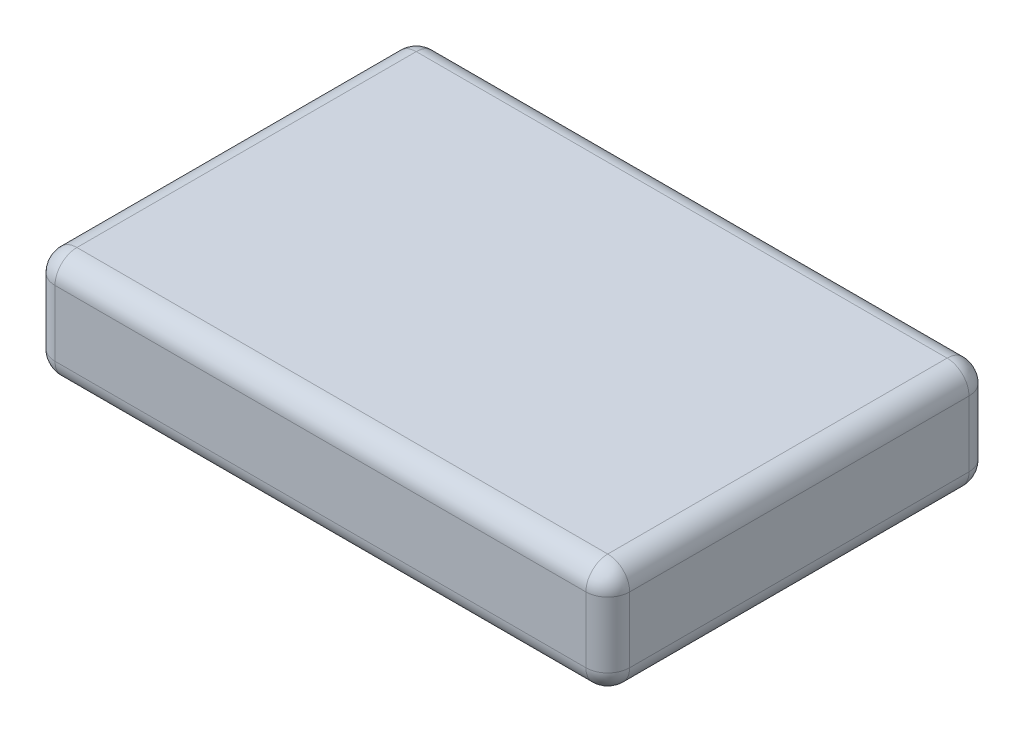
ISO-10303-21;
HEADER;
FILE_DESCRIPTION(('STEP AP214'),'2;1');
FILE_NAME('part.step','',(''),(''),'','','');
FILE_SCHEMA(('AUTOMOTIVE_DESIGN { 1 0 10303 214 1 1 1 1 }'));
ENDSEC;
DATA;
#1=APPLICATION_CONTEXT('core data for automotive mechanical design processes');
#2=APPLICATION_PROTOCOL_DEFINITION('international standard','automotive_design',2000,#1);
#3=PRODUCT_CONTEXT('',#1,'mechanical');
#4=PRODUCT('Part','Part','',(#3));
#5=PRODUCT_RELATED_PRODUCT_CATEGORY('part','',(#4));
#6=PRODUCT_DEFINITION_FORMATION('','',#4);
#7=PRODUCT_DEFINITION_CONTEXT('part definition',#1,'design');
#8=PRODUCT_DEFINITION('design','',#6,#7);
#9=PRODUCT_DEFINITION_SHAPE('','',#8);
#10=(LENGTH_UNIT() NAMED_UNIT(*) SI_UNIT(.MILLI.,.METRE.));
#11=(NAMED_UNIT(*) PLANE_ANGLE_UNIT() SI_UNIT($,.RADIAN.));
#12=(NAMED_UNIT(*) SI_UNIT($,.STERADIAN.) SOLID_ANGLE_UNIT());
#13=UNCERTAINTY_MEASURE_WITH_UNIT(LENGTH_MEASURE(1.E-05),#10,'distance_accuracy_value','');
#14=(GEOMETRIC_REPRESENTATION_CONTEXT(3) GLOBAL_UNCERTAINTY_ASSIGNED_CONTEXT((#13)) GLOBAL_UNIT_ASSIGNED_CONTEXT((#10,
#11,#12)) REPRESENTATION_CONTEXT('',''));
#15=CARTESIAN_POINT('',(0.,0.,0.));
#16=DIRECTION('',(0.,0.,1.));
#17=DIRECTION('',(1.,0.,0.));
#18=AXIS2_PLACEMENT_3D('',#15,#16,#17);
#19=CARTESIAN_POINT('',(48.5,28.,46.));
#20=DIRECTION('',(0.,-1.,0.));
#21=DIRECTION('',(1.,0.,0.));
#22=AXIS2_PLACEMENT_3D('',#19,#20,#21);
#23=SPHERICAL_SURFACE('',#22,4.);
#24=CARTESIAN_POINT('',(48.5,28.,46.));
#25=DIRECTION('',(0.,0.,-1.));
#26=DIRECTION('',(1.,0.,0.));
#27=AXIS2_PLACEMENT_3D('',#24,#25,#26);
#28=CIRCLE('',#27,4.);
#29=CARTESIAN_POINT('',(48.5,32.,46.));
#30=VERTEX_POINT('',#29);
#31=CARTESIAN_POINT('',(52.5,28.,46.));
#32=VERTEX_POINT('',#31);
#33=EDGE_CURVE('E10',#30,#32,#28,.T.);
#34=ORIENTED_EDGE('',*,*,#33,.F.);
#35=CARTESIAN_POINT('',(48.5,28.,46.));
#36=DIRECTION('',(1.,0.,0.));
#37=DIRECTION('',(0.,0.,1.));
#38=AXIS2_PLACEMENT_3D('',#35,#36,#37);
#39=CIRCLE('',#38,4.);
#40=CARTESIAN_POINT('',(48.5,28.,50.));
#41=VERTEX_POINT('',#40);
#42=EDGE_CURVE('E228',#30,#41,#39,.T.);
#43=ORIENTED_EDGE('',*,*,#42,.T.);
#44=CARTESIAN_POINT('',(48.5,28.,46.));
#45=DIRECTION('',(0.,-1.,0.));
#46=DIRECTION('',(1.,0.,0.));
#47=AXIS2_PLACEMENT_3D('',#44,#45,#46);
#48=CIRCLE('',#47,4.);
#49=EDGE_CURVE('E189',#32,#41,#48,.T.);
#50=ORIENTED_EDGE('',*,*,#49,.F.);
#51=EDGE_LOOP('',(#34,#43,#50));
#52=FACE_BOUND('',#51,.T.);
#53=ADVANCED_FACE('F16',(#52),#23,.T.);
#54=CARTESIAN_POINT('',(48.5,28.,-16.));
#55=DIRECTION('',(0.,0.,1.));
#56=DIRECTION('',(1.,0.,0.));
#57=AXIS2_PLACEMENT_3D('',#54,#55,#56);
#58=SPHERICAL_SURFACE('',#57,4.);
#59=CARTESIAN_POINT('',(48.5,28.,-16.));
#60=DIRECTION('',(0.,-1.,0.));
#61=DIRECTION('',(1.,0.,0.));
#62=AXIS2_PLACEMENT_3D('',#59,#60,#61);
#63=CIRCLE('',#62,4.);
#64=CARTESIAN_POINT('',(48.5,28.,-20.));
#65=VERTEX_POINT('',#64);
#66=CARTESIAN_POINT('',(52.5,28.,-16.));
#67=VERTEX_POINT('',#66);
#68=EDGE_CURVE('E186',#65,#67,#63,.T.);
#69=ORIENTED_EDGE('',*,*,#68,.F.);
#70=CARTESIAN_POINT('',(48.5,28.,-16.));
#71=DIRECTION('',(1.,0.,0.));
#72=DIRECTION('',(0.,1.,0.));
#73=AXIS2_PLACEMENT_3D('',#70,#71,#72);
#74=CIRCLE('',#73,4.);
#75=CARTESIAN_POINT('',(48.5,32.,-16.));
#76=VERTEX_POINT('',#75);
#77=EDGE_CURVE('E280',#65,#76,#74,.T.);
#78=ORIENTED_EDGE('',*,*,#77,.T.);
#79=CARTESIAN_POINT('',(48.5,28.,-16.));
#80=DIRECTION('',(0.,0.,1.));
#81=DIRECTION('',(1.,0.,0.));
#82=AXIS2_PLACEMENT_3D('',#79,#80,#81);
#83=CIRCLE('',#82,4.);
#84=EDGE_CURVE('E25',#67,#76,#83,.T.);
#85=ORIENTED_EDGE('',*,*,#84,.F.);
#86=EDGE_LOOP('',(#69,#78,#85));
#87=FACE_BOUND('',#86,.T.);
#88=ADVANCED_FACE('F330',(#87),#58,.T.);
#89=CARTESIAN_POINT('',(52.5,12.,-20.));
#90=DIRECTION('',(1.,0.,0.));
#91=DIRECTION('',(0.,1.,0.));
#92=AXIS2_PLACEMENT_3D('',#89,#90,#91);
#93=PLANE('',#92);
#94=DIRECTION('',(0.,0.,1.));
#95=VECTOR('',#94,1.);
#96=CARTESIAN_POINT('',(52.5,16.,-20.));
#97=LINE('',#96,#95);
#98=CARTESIAN_POINT('',(52.5,16.,-16.));
#99=VERTEX_POINT('',#98);
#100=CARTESIAN_POINT('',(52.5,16.,46.));
#101=VERTEX_POINT('',#100);
#102=EDGE_CURVE('E206',#99,#101,#97,.T.);
#103=ORIENTED_EDGE('',*,*,#102,.F.);
#104=DIRECTION('',(0.,1.,0.));
#105=VECTOR('',#104,1.);
#106=CARTESIAN_POINT('',(52.5,12.,-16.));
#107=LINE('',#106,#105);
#108=EDGE_CURVE('E232',#99,#67,#107,.T.);
#109=ORIENTED_EDGE('',*,*,#108,.T.);
#110=DIRECTION('',(0.,0.,1.));
#111=VECTOR('',#110,1.);
#112=CARTESIAN_POINT('',(52.5,28.,-20.));
#113=LINE('',#112,#111);
#114=EDGE_CURVE('E241',#67,#32,#113,.T.);
#115=ORIENTED_EDGE('',*,*,#114,.T.);
#116=DIRECTION('',(0.,1.,0.));
#117=VECTOR('',#116,1.);
#118=CARTESIAN_POINT('',(52.5,12.,46.));
#119=LINE('',#118,#117);
#120=EDGE_CURVE('E192',#101,#32,#119,.T.);
#121=ORIENTED_EDGE('',*,*,#120,.F.);
#122=EDGE_LOOP('',(#103,#109,#115,#121));
#123=FACE_BOUND('',#122,.T.);
#124=ADVANCED_FACE('F361',(#123),#93,.T.);
#125=CARTESIAN_POINT('',(48.5,16.,46.));
#126=DIRECTION('',(0.,0.,-1.));
#127=DIRECTION('',(1.,0.,0.));
#128=AXIS2_PLACEMENT_3D('',#125,#126,#127);
#129=SPHERICAL_SURFACE('',#128,4.);
#130=CARTESIAN_POINT('',(48.5,16.,46.));
#131=DIRECTION('',(0.,1.,0.));
#132=DIRECTION('',(1.,0.,0.));
#133=AXIS2_PLACEMENT_3D('',#130,#131,#132);
#134=CIRCLE('',#133,4.);
#135=CARTESIAN_POINT('',(48.5,16.,50.));
#136=VERTEX_POINT('',#135);
#137=EDGE_CURVE('E19',#136,#101,#134,.T.);
#138=ORIENTED_EDGE('',*,*,#137,.F.);
#139=CARTESIAN_POINT('',(48.5,16.,46.));
#140=DIRECTION('',(1.,0.,0.));
#141=DIRECTION('',(0.,-1.,0.));
#142=AXIS2_PLACEMENT_3D('',#139,#140,#141);
#143=CIRCLE('',#142,4.);
#144=CARTESIAN_POINT('',(48.5,12.,46.));
#145=VERTEX_POINT('',#144);
#146=EDGE_CURVE('E305',#136,#145,#143,.T.);
#147=ORIENTED_EDGE('',*,*,#146,.T.);
#148=CARTESIAN_POINT('',(48.5,16.,46.));
#149=DIRECTION('',(0.,0.,-1.));
#150=DIRECTION('',(1.,0.,0.));
#151=AXIS2_PLACEMENT_3D('',#148,#149,#150);
#152=CIRCLE('',#151,4.);
#153=EDGE_CURVE('E207',#101,#145,#152,.T.);
#154=ORIENTED_EDGE('',*,*,#153,.F.);
#155=EDGE_LOOP('',(#138,#147,#154));
#156=FACE_BOUND('',#155,.T.);
#157=ADVANCED_FACE('F368',(#156),#129,.T.);
#158=CARTESIAN_POINT('',(48.5,16.,-16.));
#159=DIRECTION('',(0.,0.,1.));
#160=DIRECTION('',(1.,0.,0.));
#161=AXIS2_PLACEMENT_3D('',#158,#159,#160);
#162=SPHERICAL_SURFACE('',#161,4.);
#163=CARTESIAN_POINT('',(48.5,16.,-16.));
#164=DIRECTION('',(0.,0.,-1.));
#165=DIRECTION('',(1.,0.,0.));
#166=AXIS2_PLACEMENT_3D('',#163,#164,#165);
#167=CIRCLE('',#166,4.);
#168=CARTESIAN_POINT('',(48.5,12.,-16.));
#169=VERTEX_POINT('',#168);
#170=EDGE_CURVE('E203',#99,#169,#167,.T.);
#171=ORIENTED_EDGE('',*,*,#170,.T.);
#172=CARTESIAN_POINT('',(48.5,16.,-16.));
#173=DIRECTION('',(-1.,0.,0.));
#174=DIRECTION('',(0.,-1.,0.));
#175=AXIS2_PLACEMENT_3D('',#172,#173,#174);
#176=CIRCLE('',#175,4.);
#177=CARTESIAN_POINT('',(48.5,16.,-20.));
#178=VERTEX_POINT('',#177);
#179=EDGE_CURVE('E301',#178,#169,#176,.T.);
#180=ORIENTED_EDGE('',*,*,#179,.F.);
#181=CARTESIAN_POINT('',(48.5,16.,-16.));
#182=DIRECTION('',(0.,-1.,0.));
#183=DIRECTION('',(1.,0.,0.));
#184=AXIS2_PLACEMENT_3D('',#181,#182,#183);
#185=CIRCLE('',#184,4.);
#186=EDGE_CURVE('E283',#178,#99,#185,.T.);
#187=ORIENTED_EDGE('',*,*,#186,.T.);
#188=EDGE_LOOP('',(#171,#180,#187));
#189=FACE_BOUND('',#188,.T.);
#190=ADVANCED_FACE('F411',(#189),#162,.T.);
#191=CARTESIAN_POINT('',(48.5,28.,-20.));
#192=DIRECTION('',(0.,0.,1.));
#193=DIRECTION('',(1.,0.,0.));
#194=AXIS2_PLACEMENT_3D('',#191,#192,#193);
#195=CYLINDRICAL_SURFACE('',#194,4.);
#196=ORIENTED_EDGE('',*,*,#114,.F.);
#197=ORIENTED_EDGE('',*,*,#84,.T.);
#198=DIRECTION('',(0.,0.,1.));
#199=VECTOR('',#198,1.);
#200=CARTESIAN_POINT('',(48.5,32.,-20.));
#201=LINE('',#200,#199);
#202=EDGE_CURVE('E294',#76,#30,#201,.T.);
#203=ORIENTED_EDGE('',*,*,#202,.T.);
#204=ORIENTED_EDGE('',*,*,#33,.T.);
#205=EDGE_LOOP('',(#196,#197,#203,#204));
#206=FACE_BOUND('',#205,.T.);
#207=ADVANCED_FACE('F337',(#206),#195,.T.);
#208=CARTESIAN_POINT('',(48.5,12.,46.));
#209=DIRECTION('',(0.,1.,0.));
#210=DIRECTION('',(1.,0.,0.));
#211=AXIS2_PLACEMENT_3D('',#208,#209,#210);
#212=CYLINDRICAL_SURFACE('',#211,4.);
#213=ORIENTED_EDGE('',*,*,#120,.T.);
#214=ORIENTED_EDGE('',*,*,#49,.T.);
#215=DIRECTION('',(0.,1.,0.));
#216=VECTOR('',#215,1.);
#217=CARTESIAN_POINT('',(48.5,12.,50.));
#218=LINE('',#217,#216);
#219=EDGE_CURVE('E275',#136,#41,#218,.T.);
#220=ORIENTED_EDGE('',*,*,#219,.F.);
#221=ORIENTED_EDGE('',*,*,#137,.T.);
#222=EDGE_LOOP('',(#213,#214,#220,#221));
#223=FACE_BOUND('',#222,.T.);
#224=ADVANCED_FACE('F360',(#223),#212,.T.);
#225=CARTESIAN_POINT('',(-52.5,28.,46.));
#226=DIRECTION('',(1.,0.,0.));
#227=DIRECTION('',(0.,1.,0.));
#228=AXIS2_PLACEMENT_3D('',#225,#226,#227);
#229=CYLINDRICAL_SURFACE('',#228,4.);
#230=CARTESIAN_POINT('',(-48.5,28.,46.));
#231=DIRECTION('',(1.,0.,0.));
#232=DIRECTION('',(0.,0.,1.));
#233=AXIS2_PLACEMENT_3D('',#230,#231,#232);
#234=CIRCLE('',#233,4.);
#235=CARTESIAN_POINT('',(-48.5,32.,46.));
#236=VERTEX_POINT('',#235);
#237=CARTESIAN_POINT('',(-48.5,28.,50.));
#238=VERTEX_POINT('',#237);
#239=EDGE_CURVE('E287',#236,#238,#234,.T.);
#240=ORIENTED_EDGE('',*,*,#239,.T.);
#241=DIRECTION('',(1.,0.,0.));
#242=VECTOR('',#241,1.);
#243=CARTESIAN_POINT('',(-52.5,28.,50.));
#244=LINE('',#243,#242);
#245=EDGE_CURVE('E279',#238,#41,#244,.T.);
#246=ORIENTED_EDGE('',*,*,#245,.T.);
#247=ORIENTED_EDGE('',*,*,#42,.F.);
#248=DIRECTION('',(1.,0.,0.));
#249=VECTOR('',#248,1.);
#250=CARTESIAN_POINT('',(-52.5,32.,46.));
#251=LINE('',#250,#249);
#252=EDGE_CURVE('E290',#236,#30,#251,.T.);
#253=ORIENTED_EDGE('',*,*,#252,.F.);
#254=EDGE_LOOP('',(#240,#246,#247,#253));
#255=FACE_BOUND('',#254,.T.);
#256=ADVANCED_FACE('F355',(#255),#229,.T.);
#257=CARTESIAN_POINT('',(48.5,12.,-16.));
#258=DIRECTION('',(0.,1.,0.));
#259=DIRECTION('',(1.,0.,0.));
#260=AXIS2_PLACEMENT_3D('',#257,#258,#259);
#261=CYLINDRICAL_SURFACE('',#260,4.);
#262=ORIENTED_EDGE('',*,*,#186,.F.);
#263=DIRECTION('',(0.,1.,0.));
#264=VECTOR('',#263,1.);
#265=CARTESIAN_POINT('',(48.5,12.,-20.));
#266=LINE('',#265,#264);
#267=EDGE_CURVE('E259',#178,#65,#266,.T.);
#268=ORIENTED_EDGE('',*,*,#267,.T.);
#269=ORIENTED_EDGE('',*,*,#68,.T.);
#270=ORIENTED_EDGE('',*,*,#108,.F.);
#271=EDGE_LOOP('',(#262,#268,#269,#270));
#272=FACE_BOUND('',#271,.T.);
#273=ADVANCED_FACE('F327',(#272),#261,.T.);
#274=CARTESIAN_POINT('',(-52.5,28.,-16.));
#275=DIRECTION('',(1.,0.,0.));
#276=DIRECTION('',(0.,1.,0.));
#277=AXIS2_PLACEMENT_3D('',#274,#275,#276);
#278=CYLINDRICAL_SURFACE('',#277,4.);
#279=DIRECTION('',(1.,0.,0.));
#280=VECTOR('',#279,1.);
#281=CARTESIAN_POINT('',(-52.5,32.,-16.));
#282=LINE('',#281,#280);
#283=CARTESIAN_POINT('',(-48.5,32.,-16.));
#284=VERTEX_POINT('',#283);
#285=EDGE_CURVE('E297',#284,#76,#282,.T.);
#286=ORIENTED_EDGE('',*,*,#285,.T.);
#287=ORIENTED_EDGE('',*,*,#77,.F.);
#288=DIRECTION('',(1.,0.,0.));
#289=VECTOR('',#288,1.);
#290=CARTESIAN_POINT('',(-52.5,28.,-20.));
#291=LINE('',#290,#289);
#292=CARTESIAN_POINT('',(-48.5,28.,-20.));
#293=VERTEX_POINT('',#292);
#294=EDGE_CURVE('E220',#293,#65,#291,.T.);
#295=ORIENTED_EDGE('',*,*,#294,.F.);
#296=CARTESIAN_POINT('',(-48.5,28.,-16.));
#297=DIRECTION('',(1.,0.,0.));
#298=DIRECTION('',(0.,1.,0.));
#299=AXIS2_PLACEMENT_3D('',#296,#297,#298);
#300=CIRCLE('',#299,4.);
#301=EDGE_CURVE('E267',#293,#284,#300,.T.);
#302=ORIENTED_EDGE('',*,*,#301,.T.);
#303=EDGE_LOOP('',(#286,#287,#295,#302));
#304=FACE_BOUND('',#303,.T.);
#305=ADVANCED_FACE('F333',(#304),#278,.T.);
#306=CARTESIAN_POINT('',(48.5,16.,-20.));
#307=DIRECTION('',(0.,0.,1.));
#308=DIRECTION('',(1.,0.,0.));
#309=AXIS2_PLACEMENT_3D('',#306,#307,#308);
#310=CYLINDRICAL_SURFACE('',#309,4.);
#311=ORIENTED_EDGE('',*,*,#153,.T.);
#312=DIRECTION('',(0.,0.,1.));
#313=VECTOR('',#312,1.);
#314=CARTESIAN_POINT('',(48.5,12.,-20.));
#315=LINE('',#314,#313);
#316=EDGE_CURVE('E221',#169,#145,#315,.T.);
#317=ORIENTED_EDGE('',*,*,#316,.F.);
#318=ORIENTED_EDGE('',*,*,#170,.F.);
#319=ORIENTED_EDGE('',*,*,#102,.T.);
#320=EDGE_LOOP('',(#311,#317,#318,#319));
#321=FACE_BOUND('',#320,.T.);
#322=ADVANCED_FACE('F365',(#321),#310,.T.);
#323=CARTESIAN_POINT('',(-52.5,16.,46.));
#324=DIRECTION('',(1.,0.,0.));
#325=DIRECTION('',(0.,-1.,0.));
#326=AXIS2_PLACEMENT_3D('',#323,#324,#325);
#327=CYLINDRICAL_SURFACE('',#326,4.);
#328=DIRECTION('',(1.,0.,0.));
#329=VECTOR('',#328,1.);
#330=CARTESIAN_POINT('',(-52.5,12.,46.));
#331=LINE('',#330,#329);
#332=CARTESIAN_POINT('',(-48.5,12.,46.));
#333=VERTEX_POINT('',#332);
#334=EDGE_CURVE('E217',#333,#145,#331,.T.);
#335=ORIENTED_EDGE('',*,*,#334,.T.);
#336=ORIENTED_EDGE('',*,*,#146,.F.);
#337=DIRECTION('',(1.,0.,0.));
#338=VECTOR('',#337,1.);
#339=CARTESIAN_POINT('',(-52.5,16.,50.));
#340=LINE('',#339,#338);
#341=CARTESIAN_POINT('',(-48.5,16.,50.));
#342=VERTEX_POINT('',#341);
#343=EDGE_CURVE('E271',#342,#136,#340,.T.);
#344=ORIENTED_EDGE('',*,*,#343,.F.);
#345=CARTESIAN_POINT('',(-48.5,16.,46.));
#346=DIRECTION('',(1.,0.,0.));
#347=DIRECTION('',(0.,-1.,0.));
#348=AXIS2_PLACEMENT_3D('',#345,#346,#347);
#349=CIRCLE('',#348,4.);
#350=EDGE_CURVE('E141',#342,#333,#349,.T.);
#351=ORIENTED_EDGE('',*,*,#350,.T.);
#352=EDGE_LOOP('',(#335,#336,#344,#351));
#353=FACE_BOUND('',#352,.T.);
#354=ADVANCED_FACE('F371',(#353),#327,.T.);
#355=CARTESIAN_POINT('',(-52.5,16.,-16.));
#356=DIRECTION('',(1.,0.,0.));
#357=DIRECTION('',(0.,-1.,0.));
#358=AXIS2_PLACEMENT_3D('',#355,#356,#357);
#359=CYLINDRICAL_SURFACE('',#358,4.);
#360=CARTESIAN_POINT('',(-48.5,16.,-16.));
#361=DIRECTION('',(-1.,0.,0.));
#362=DIRECTION('',(0.,-1.,0.));
#363=AXIS2_PLACEMENT_3D('',#360,#361,#362);
#364=CIRCLE('',#363,4.);
#365=CARTESIAN_POINT('',(-48.5,16.,-20.));
#366=VERTEX_POINT('',#365);
#367=CARTESIAN_POINT('',(-48.5,12.,-16.));
#368=VERTEX_POINT('',#367);
#369=EDGE_CURVE('E240',#366,#368,#364,.T.);
#370=ORIENTED_EDGE('',*,*,#369,.F.);
#371=DIRECTION('',(1.,0.,0.));
#372=VECTOR('',#371,1.);
#373=CARTESIAN_POINT('',(-52.5,16.,-20.));
#374=LINE('',#373,#372);
#375=EDGE_CURVE('E263',#366,#178,#374,.T.);
#376=ORIENTED_EDGE('',*,*,#375,.T.);
#377=ORIENTED_EDGE('',*,*,#179,.T.);
#378=DIRECTION('',(1.,0.,0.));
#379=VECTOR('',#378,1.);
#380=CARTESIAN_POINT('',(-52.5,12.,-16.));
#381=LINE('',#380,#379);
#382=EDGE_CURVE('E249',#368,#169,#381,.T.);
#383=ORIENTED_EDGE('',*,*,#382,.F.);
#384=EDGE_LOOP('',(#370,#376,#377,#383));
#385=FACE_BOUND('',#384,.T.);
#386=ADVANCED_FACE('F376',(#385),#359,.T.);
#387=CARTESIAN_POINT('',(-52.5,32.,-20.));
#388=DIRECTION('',(0.,1.,0.));
#389=DIRECTION('',(1.,0.,0.));
#390=AXIS2_PLACEMENT_3D('',#387,#388,#389);
#391=PLANE('',#390);
#392=DIRECTION('',(0.,0.,1.));
#393=VECTOR('',#392,1.);
#394=CARTESIAN_POINT('',(-48.5,32.,-20.));
#395=LINE('',#394,#393);
#396=EDGE_CURVE('E200',#284,#236,#395,.T.);
#397=ORIENTED_EDGE('',*,*,#396,.T.);
#398=ORIENTED_EDGE('',*,*,#252,.T.);
#399=ORIENTED_EDGE('',*,*,#202,.F.);
#400=ORIENTED_EDGE('',*,*,#285,.F.);
#401=EDGE_LOOP('',(#397,#398,#399,#400));
#402=FACE_BOUND('',#401,.T.);
#403=ADVANCED_FACE('F336',(#402),#391,.T.);
#404=CARTESIAN_POINT('',(-48.5,28.,46.));
#405=DIRECTION('',(0.,-1.,0.));
#406=DIRECTION('',(-1.,0.,0.));
#407=AXIS2_PLACEMENT_3D('',#404,#405,#406);
#408=SPHERICAL_SURFACE('',#407,4.);
#409=CARTESIAN_POINT('',(-48.5,28.,46.));
#410=DIRECTION('',(0.,1.,0.));
#411=DIRECTION('',(-1.,0.,0.));
#412=AXIS2_PLACEMENT_3D('',#409,#410,#411);
#413=CIRCLE('',#412,4.);
#414=CARTESIAN_POINT('',(-52.5,28.,46.));
#415=VERTEX_POINT('',#414);
#416=EDGE_CURVE('E175',#415,#238,#413,.T.);
#417=ORIENTED_EDGE('',*,*,#416,.T.);
#418=ORIENTED_EDGE('',*,*,#239,.F.);
#419=CARTESIAN_POINT('',(-48.5,28.,46.));
#420=DIRECTION('',(0.,0.,1.));
#421=DIRECTION('',(-1.,0.,0.));
#422=AXIS2_PLACEMENT_3D('',#419,#420,#421);
#423=CIRCLE('',#422,4.);
#424=EDGE_CURVE('E197',#236,#415,#423,.T.);
#425=ORIENTED_EDGE('',*,*,#424,.T.);
#426=EDGE_LOOP('',(#417,#418,#425));
#427=FACE_BOUND('',#426,.T.);
#428=ADVANCED_FACE('F347',(#427),#408,.T.);
#429=CARTESIAN_POINT('',(-52.5,12.,50.));
#430=DIRECTION('',(0.,0.,1.));
#431=DIRECTION('',(1.,0.,0.));
#432=AXIS2_PLACEMENT_3D('',#429,#430,#431);
#433=PLANE('',#432);
#434=DIRECTION('',(0.,1.,0.));
#435=VECTOR('',#434,1.);
#436=CARTESIAN_POINT('',(-48.5,12.,50.));
#437=LINE('',#436,#435);
#438=EDGE_CURVE('E147',#342,#238,#437,.T.);
#439=ORIENTED_EDGE('',*,*,#438,.F.);
#440=ORIENTED_EDGE('',*,*,#343,.T.);
#441=ORIENTED_EDGE('',*,*,#219,.T.);
#442=ORIENTED_EDGE('',*,*,#245,.F.);
#443=EDGE_LOOP('',(#439,#440,#441,#442));
#444=FACE_BOUND('',#443,.T.);
#445=ADVANCED_FACE('F351',(#444),#433,.T.);
#446=CARTESIAN_POINT('',(-48.5,28.,-16.));
#447=DIRECTION('',(0.,0.,1.));
#448=DIRECTION('',(-1.,0.,0.));
#449=AXIS2_PLACEMENT_3D('',#446,#447,#448);
#450=SPHERICAL_SURFACE('',#449,4.);
#451=CARTESIAN_POINT('',(-48.5,28.,-16.));
#452=DIRECTION('',(0.,0.,-1.));
#453=DIRECTION('',(-1.,0.,0.));
#454=AXIS2_PLACEMENT_3D('',#451,#452,#453);
#455=CIRCLE('',#454,4.);
#456=CARTESIAN_POINT('',(-52.5,28.,-16.));
#457=VERTEX_POINT('',#456);
#458=EDGE_CURVE('E236',#457,#284,#455,.T.);
#459=ORIENTED_EDGE('',*,*,#458,.T.);
#460=ORIENTED_EDGE('',*,*,#301,.F.);
#461=CARTESIAN_POINT('',(-48.5,28.,-16.));
#462=DIRECTION('',(0.,1.,0.));
#463=DIRECTION('',(-1.,0.,0.));
#464=AXIS2_PLACEMENT_3D('',#461,#462,#463);
#465=CIRCLE('',#464,4.);
#466=EDGE_CURVE('E160',#293,#457,#465,.T.);
#467=ORIENTED_EDGE('',*,*,#466,.T.);
#468=EDGE_LOOP('',(#459,#460,#467));
#469=FACE_BOUND('',#468,.T.);
#470=ADVANCED_FACE('F389',(#469),#450,.T.);
#471=CARTESIAN_POINT('',(-52.5,12.,-20.));
#472=DIRECTION('',(0.,0.,1.));
#473=DIRECTION('',(1.,0.,0.));
#474=AXIS2_PLACEMENT_3D('',#471,#472,#473);
#475=PLANE('',#474);
#476=ORIENTED_EDGE('',*,*,#294,.T.);
#477=ORIENTED_EDGE('',*,*,#267,.F.);
#478=ORIENTED_EDGE('',*,*,#375,.F.);
#479=DIRECTION('',(0.,1.,0.));
#480=VECTOR('',#479,1.);
#481=CARTESIAN_POINT('',(-48.5,12.,-20.));
#482=LINE('',#481,#480);
#483=EDGE_CURVE('E208',#366,#293,#482,.T.);
#484=ORIENTED_EDGE('',*,*,#483,.T.);
#485=EDGE_LOOP('',(#476,#477,#478,#484));
#486=FACE_BOUND('',#485,.T.);
#487=ADVANCED_FACE('F387',(#486),#475,.F.);
#488=CARTESIAN_POINT('',(-52.5,12.,-20.));
#489=DIRECTION('',(0.,1.,0.));
#490=DIRECTION('',(1.,0.,0.));
#491=AXIS2_PLACEMENT_3D('',#488,#489,#490);
#492=PLANE('',#491);
#493=ORIENTED_EDGE('',*,*,#382,.T.);
#494=ORIENTED_EDGE('',*,*,#316,.T.);
#495=ORIENTED_EDGE('',*,*,#334,.F.);
#496=DIRECTION('',(0.,0.,1.));
#497=VECTOR('',#496,1.);
#498=CARTESIAN_POINT('',(-48.5,12.,-20.));
#499=LINE('',#498,#497);
#500=EDGE_CURVE('E158',#368,#333,#499,.T.);
#501=ORIENTED_EDGE('',*,*,#500,.F.);
#502=EDGE_LOOP('',(#493,#494,#495,#501));
#503=FACE_BOUND('',#502,.T.);
#504=ADVANCED_FACE('F373',(#503),#492,.F.);
#505=CARTESIAN_POINT('',(-48.5,16.,46.));
#506=DIRECTION('',(0.,0.,-1.));
#507=DIRECTION('',(-1.,0.,0.));
#508=AXIS2_PLACEMENT_3D('',#505,#506,#507);
#509=SPHERICAL_SURFACE('',#508,4.);
#510=CARTESIAN_POINT('',(-48.5,16.,46.));
#511=DIRECTION('',(0.,0.,1.));
#512=DIRECTION('',(-1.,0.,0.));
#513=AXIS2_PLACEMENT_3D('',#510,#511,#512);
#514=CIRCLE('',#513,4.);
#515=CARTESIAN_POINT('',(-52.5,16.,46.));
#516=VERTEX_POINT('',#515);
#517=EDGE_CURVE('E138',#516,#333,#514,.T.);
#518=ORIENTED_EDGE('',*,*,#517,.T.);
#519=ORIENTED_EDGE('',*,*,#350,.F.);
#520=CARTESIAN_POINT('',(-48.5,16.,46.));
#521=DIRECTION('',(0.,-1.,0.));
#522=DIRECTION('',(-1.,0.,0.));
#523=AXIS2_PLACEMENT_3D('',#520,#521,#522);
#524=CIRCLE('',#523,4.);
#525=EDGE_CURVE('E135',#342,#516,#524,.T.);
#526=ORIENTED_EDGE('',*,*,#525,.T.);
#527=EDGE_LOOP('',(#518,#519,#526));
#528=FACE_BOUND('',#527,.T.);
#529=ADVANCED_FACE('F137',(#528),#509,.T.);
#530=CARTESIAN_POINT('',(-48.5,16.,-16.));
#531=DIRECTION('',(0.,0.,1.));
#532=DIRECTION('',(-1.,0.,0.));
#533=AXIS2_PLACEMENT_3D('',#530,#531,#532);
#534=SPHERICAL_SURFACE('',#533,4.);
#535=CARTESIAN_POINT('',(-48.5,16.,-16.));
#536=DIRECTION('',(0.,1.,0.));
#537=DIRECTION('',(-1.,0.,0.));
#538=AXIS2_PLACEMENT_3D('',#535,#536,#537);
#539=CIRCLE('',#538,4.);
#540=CARTESIAN_POINT('',(-52.5,16.,-16.));
#541=VERTEX_POINT('',#540);
#542=EDGE_CURVE('E148',#366,#541,#539,.T.);
#543=ORIENTED_EDGE('',*,*,#542,.F.);
#544=ORIENTED_EDGE('',*,*,#369,.T.);
#545=CARTESIAN_POINT('',(-48.5,16.,-16.));
#546=DIRECTION('',(0.,0.,1.));
#547=DIRECTION('',(-1.,0.,0.));
#548=AXIS2_PLACEMENT_3D('',#545,#546,#547);
#549=CIRCLE('',#548,4.);
#550=EDGE_CURVE('E170',#541,#368,#549,.T.);
#551=ORIENTED_EDGE('',*,*,#550,.F.);
#552=EDGE_LOOP('',(#543,#544,#551));
#553=FACE_BOUND('',#552,.T.);
#554=ADVANCED_FACE('F381',(#553),#534,.T.);
#555=CARTESIAN_POINT('',(-48.5,28.,-20.));
#556=DIRECTION('',(0.,0.,1.));
#557=DIRECTION('',(-1.,0.,0.));
#558=AXIS2_PLACEMENT_3D('',#555,#556,#557);
#559=CYLINDRICAL_SURFACE('',#558,4.);
#560=ORIENTED_EDGE('',*,*,#424,.F.);
#561=ORIENTED_EDGE('',*,*,#396,.F.);
#562=ORIENTED_EDGE('',*,*,#458,.F.);
#563=DIRECTION('',(0.,0.,1.));
#564=VECTOR('',#563,1.);
#565=CARTESIAN_POINT('',(-52.5,28.,-20.));
#566=LINE('',#565,#564);
#567=EDGE_CURVE('E178',#457,#415,#566,.T.);
#568=ORIENTED_EDGE('',*,*,#567,.T.);
#569=EDGE_LOOP('',(#560,#561,#562,#568));
#570=FACE_BOUND('',#569,.T.);
#571=ADVANCED_FACE('F449',(#570),#559,.T.);
#572=CARTESIAN_POINT('',(-48.5,12.,46.));
#573=DIRECTION('',(0.,1.,0.));
#574=DIRECTION('',(-1.,0.,0.));
#575=AXIS2_PLACEMENT_3D('',#572,#573,#574);
#576=CYLINDRICAL_SURFACE('',#575,4.);
#577=ORIENTED_EDGE('',*,*,#525,.F.);
#578=ORIENTED_EDGE('',*,*,#438,.T.);
#579=ORIENTED_EDGE('',*,*,#416,.F.);
#580=DIRECTION('',(0.,1.,0.));
#581=VECTOR('',#580,1.);
#582=CARTESIAN_POINT('',(-52.5,12.,46.));
#583=LINE('',#582,#581);
#584=EDGE_CURVE('E166',#516,#415,#583,.T.);
#585=ORIENTED_EDGE('',*,*,#584,.F.);
#586=EDGE_LOOP('',(#577,#578,#579,#585));
#587=FACE_BOUND('',#586,.T.);
#588=ADVANCED_FACE('F173',(#587),#576,.T.);
#589=CARTESIAN_POINT('',(-48.5,12.,-16.));
#590=DIRECTION('',(0.,1.,0.));
#591=DIRECTION('',(-1.,0.,0.));
#592=AXIS2_PLACEMENT_3D('',#589,#590,#591);
#593=CYLINDRICAL_SURFACE('',#592,4.);
#594=DIRECTION('',(0.,1.,0.));
#595=VECTOR('',#594,1.);
#596=CARTESIAN_POINT('',(-52.5,12.,-16.));
#597=LINE('',#596,#595);
#598=EDGE_CURVE('E168',#541,#457,#597,.T.);
#599=ORIENTED_EDGE('',*,*,#598,.T.);
#600=ORIENTED_EDGE('',*,*,#466,.F.);
#601=ORIENTED_EDGE('',*,*,#483,.F.);
#602=ORIENTED_EDGE('',*,*,#542,.T.);
#603=EDGE_LOOP('',(#599,#600,#601,#602));
#604=FACE_BOUND('',#603,.T.);
#605=ADVANCED_FACE('F385',(#604),#593,.T.);
#606=CARTESIAN_POINT('',(-48.5,16.,-20.));
#607=DIRECTION('',(0.,0.,1.));
#608=DIRECTION('',(-1.,0.,0.));
#609=AXIS2_PLACEMENT_3D('',#606,#607,#608);
#610=CYLINDRICAL_SURFACE('',#609,4.);
#611=DIRECTION('',(0.,0.,1.));
#612=VECTOR('',#611,1.);
#613=CARTESIAN_POINT('',(-52.5,16.,-20.));
#614=LINE('',#613,#612);
#615=EDGE_CURVE('E155',#541,#516,#614,.T.);
#616=ORIENTED_EDGE('',*,*,#615,.F.);
#617=ORIENTED_EDGE('',*,*,#550,.T.);
#618=ORIENTED_EDGE('',*,*,#500,.T.);
#619=ORIENTED_EDGE('',*,*,#517,.F.);
#620=EDGE_LOOP('',(#616,#617,#618,#619));
#621=FACE_BOUND('',#620,.T.);
#622=ADVANCED_FACE('F153',(#621),#610,.T.);
#623=CARTESIAN_POINT('',(-52.5,12.,-20.));
#624=DIRECTION('',(1.,0.,0.));
#625=DIRECTION('',(0.,1.,0.));
#626=AXIS2_PLACEMENT_3D('',#623,#624,#625);
#627=PLANE('',#626);
#628=ORIENTED_EDGE('',*,*,#584,.T.);
#629=ORIENTED_EDGE('',*,*,#567,.F.);
#630=ORIENTED_EDGE('',*,*,#598,.F.);
#631=ORIENTED_EDGE('',*,*,#615,.T.);
#632=EDGE_LOOP('',(#628,#629,#630,#631));
#633=FACE_BOUND('',#632,.T.);
#634=ADVANCED_FACE('F164',(#633),#627,.F.);
#635=CLOSED_SHELL('',(#53,#88,#124,#157,#190,#207,#224,#256,#273,#305,#322,#354,#386,#403,#428,
#445,#470,#487,#504,#529,#554,#571,#588,#605,#622,#634));
#636=MANIFOLD_SOLID_BREP('B1',#635);
#637=ADVANCED_BREP_SHAPE_REPRESENTATION('',(#18,#636),#14);
#638=SHAPE_DEFINITION_REPRESENTATION(#9,#637);
ENDSEC;
END-ISO-10303-21;
